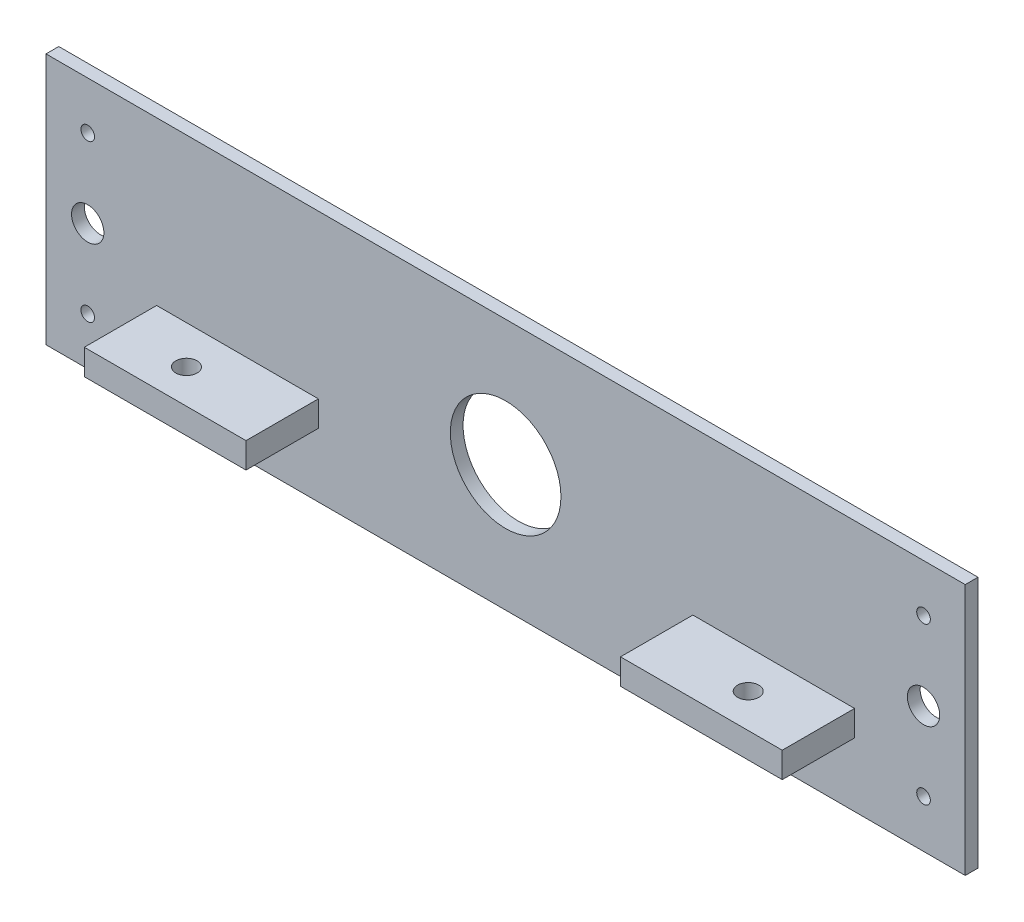
ISO-10303-21;
HEADER;
FILE_DESCRIPTION(('STEP AP214'),'2;1');
FILE_NAME('part.step','',(''),(''),'','','');
FILE_SCHEMA(('AUTOMOTIVE_DESIGN { 1 0 10303 214 1 1 1 1 }'));
ENDSEC;
DATA;
#1=APPLICATION_CONTEXT('core data for automotive mechanical design processes');
#2=APPLICATION_PROTOCOL_DEFINITION('international standard','automotive_design',2000,#1);
#3=PRODUCT_CONTEXT('',#1,'mechanical');
#4=PRODUCT('Part','Part','',(#3));
#5=PRODUCT_RELATED_PRODUCT_CATEGORY('part','',(#4));
#6=PRODUCT_DEFINITION_FORMATION('','',#4);
#7=PRODUCT_DEFINITION_CONTEXT('part definition',#1,'design');
#8=PRODUCT_DEFINITION('design','',#6,#7);
#9=PRODUCT_DEFINITION_SHAPE('','',#8);
#10=(LENGTH_UNIT() NAMED_UNIT(*) SI_UNIT(.MILLI.,.METRE.));
#11=(NAMED_UNIT(*) PLANE_ANGLE_UNIT() SI_UNIT($,.RADIAN.));
#12=(NAMED_UNIT(*) SI_UNIT($,.STERADIAN.) SOLID_ANGLE_UNIT());
#13=UNCERTAINTY_MEASURE_WITH_UNIT(LENGTH_MEASURE(1.E-05),#10,'distance_accuracy_value','');
#14=(GEOMETRIC_REPRESENTATION_CONTEXT(3) GLOBAL_UNCERTAINTY_ASSIGNED_CONTEXT((#13)) GLOBAL_UNIT_ASSIGNED_CONTEXT((#10,
#11,#12)) REPRESENTATION_CONTEXT('',''));
#15=CARTESIAN_POINT('',(0.,0.,0.));
#16=DIRECTION('',(0.,0.,1.));
#17=DIRECTION('',(1.,0.,0.));
#18=AXIS2_PLACEMENT_3D('',#15,#16,#17);
#19=CARTESIAN_POINT('',(54.,-14.8,-10.));
#20=DIRECTION('',(1.,0.,0.));
#21=DIRECTION('',(0.,0.,-1.));
#22=AXIS2_PLACEMENT_3D('',#19,#20,#21);
#23=PLANE('',#22);
#24=DIRECTION('',(0.,0.,1.));
#25=VECTOR('',#24,1.);
#26=CARTESIAN_POINT('',(54.,14.8,-10.));
#27=LINE('',#26,#25);
#28=CARTESIAN_POINT('',(54.,14.8,-10.));
#29=VERTEX_POINT('',#28);
#30=CARTESIAN_POINT('',(54.,14.8,-8.5));
#31=VERTEX_POINT('',#30);
#32=EDGE_CURVE('E239',#29,#31,#27,.T.);
#33=ORIENTED_EDGE('',*,*,#32,.T.);
#34=DIRECTION('',(0.,-1.,0.));
#35=VECTOR('',#34,1.);
#36=CARTESIAN_POINT('',(54.,-14.8,-8.5));
#37=LINE('',#36,#35);
#38=CARTESIAN_POINT('',(54.,-14.8,-8.5));
#39=VERTEX_POINT('',#38);
#40=EDGE_CURVE('E52',#31,#39,#37,.T.);
#41=ORIENTED_EDGE('',*,*,#40,.T.);
#42=DIRECTION('',(0.,0.,1.));
#43=VECTOR('',#42,1.);
#44=CARTESIAN_POINT('',(54.,-14.8,-10.));
#45=LINE('',#44,#43);
#46=CARTESIAN_POINT('',(54.,-14.8,-10.));
#47=VERTEX_POINT('',#46);
#48=EDGE_CURVE('E12',#47,#39,#45,.T.);
#49=ORIENTED_EDGE('',*,*,#48,.F.);
#50=DIRECTION('',(0.,1.,0.));
#51=VECTOR('',#50,1.);
#52=CARTESIAN_POINT('',(54.,-14.8,-10.));
#53=LINE('',#52,#51);
#54=EDGE_CURVE('E228',#47,#29,#53,.T.);
#55=ORIENTED_EDGE('',*,*,#54,.T.);
#56=EDGE_LOOP('',(#33,#41,#49,#55));
#57=FACE_BOUND('',#56,.T.);
#58=ADVANCED_FACE('F36',(#57),#23,.T.);
#59=CARTESIAN_POINT('',(-54.,-14.8,-10.));
#60=DIRECTION('',(0.,-1.,0.));
#61=DIRECTION('',(0.,0.,-1.));
#62=AXIS2_PLACEMENT_3D('',#59,#60,#61);
#63=PLANE('',#62);
#64=ORIENTED_EDGE('',*,*,#48,.T.);
#65=DIRECTION('',(-1.,0.,0.));
#66=VECTOR('',#65,1.);
#67=CARTESIAN_POINT('',(-54.,-14.8,-8.5));
#68=LINE('',#67,#66);
#69=CARTESIAN_POINT('',(-54.,-14.8,-8.5));
#70=VERTEX_POINT('',#69);
#71=EDGE_CURVE('E215',#39,#70,#68,.T.);
#72=ORIENTED_EDGE('',*,*,#71,.T.);
#73=DIRECTION('',(0.,0.,1.));
#74=VECTOR('',#73,1.);
#75=CARTESIAN_POINT('',(-54.,-14.8,-10.));
#76=LINE('',#75,#74);
#77=CARTESIAN_POINT('',(-54.,-14.8,-10.));
#78=VERTEX_POINT('',#77);
#79=EDGE_CURVE('E44',#78,#70,#76,.T.);
#80=ORIENTED_EDGE('',*,*,#79,.F.);
#81=DIRECTION('',(1.,0.,0.));
#82=VECTOR('',#81,1.);
#83=CARTESIAN_POINT('',(-54.,-14.8,-10.));
#84=LINE('',#83,#82);
#85=EDGE_CURVE('E237',#78,#47,#84,.T.);
#86=ORIENTED_EDGE('',*,*,#85,.T.);
#87=EDGE_LOOP('',(#64,#72,#80,#86));
#88=FACE_BOUND('',#87,.T.);
#89=ADVANCED_FACE('F259',(#88),#63,.T.);
#90=CARTESIAN_POINT('',(-54.,-14.8,-10.));
#91=DIRECTION('',(-1.,0.,0.));
#92=DIRECTION('',(0.,0.,1.));
#93=AXIS2_PLACEMENT_3D('',#90,#91,#92);
#94=PLANE('',#93);
#95=ORIENTED_EDGE('',*,*,#79,.T.);
#96=DIRECTION('',(0.,1.,0.));
#97=VECTOR('',#96,1.);
#98=CARTESIAN_POINT('',(-54.,-14.8,-8.5));
#99=LINE('',#98,#97);
#100=CARTESIAN_POINT('',(-54.,14.8,-8.5));
#101=VERTEX_POINT('',#100);
#102=EDGE_CURVE('E212',#70,#101,#99,.T.);
#103=ORIENTED_EDGE('',*,*,#102,.T.);
#104=DIRECTION('',(0.,0.,1.));
#105=VECTOR('',#104,1.);
#106=CARTESIAN_POINT('',(-54.,14.8,-10.));
#107=LINE('',#106,#105);
#108=CARTESIAN_POINT('',(-54.,14.8,-10.));
#109=VERTEX_POINT('',#108);
#110=EDGE_CURVE('E243',#109,#101,#107,.T.);
#111=ORIENTED_EDGE('',*,*,#110,.F.);
#112=DIRECTION('',(0.,-1.,0.));
#113=VECTOR('',#112,1.);
#114=CARTESIAN_POINT('',(-54.,-14.8,-10.));
#115=LINE('',#114,#113);
#116=EDGE_CURVE('E234',#109,#78,#115,.T.);
#117=ORIENTED_EDGE('',*,*,#116,.T.);
#118=EDGE_LOOP('',(#95,#103,#111,#117));
#119=FACE_BOUND('',#118,.T.);
#120=ADVANCED_FACE('F256',(#119),#94,.T.);
#121=CARTESIAN_POINT('',(-54.,14.8,-10.));
#122=DIRECTION('',(0.,1.,0.));
#123=DIRECTION('',(0.,0.,1.));
#124=AXIS2_PLACEMENT_3D('',#121,#122,#123);
#125=PLANE('',#124);
#126=ORIENTED_EDGE('',*,*,#110,.T.);
#127=DIRECTION('',(1.,0.,0.));
#128=VECTOR('',#127,1.);
#129=CARTESIAN_POINT('',(-54.,14.8,-8.5));
#130=LINE('',#129,#128);
#131=EDGE_CURVE('E210',#101,#31,#130,.T.);
#132=ORIENTED_EDGE('',*,*,#131,.T.);
#133=ORIENTED_EDGE('',*,*,#32,.F.);
#134=DIRECTION('',(-1.,0.,0.));
#135=VECTOR('',#134,1.);
#136=CARTESIAN_POINT('',(-54.,14.8,-10.));
#137=LINE('',#136,#135);
#138=EDGE_CURVE('E231',#29,#109,#137,.T.);
#139=ORIENTED_EDGE('',*,*,#138,.T.);
#140=EDGE_LOOP('',(#126,#132,#133,#139));
#141=FACE_BOUND('',#140,.T.);
#142=ADVANCED_FACE('F250',(#141),#125,.T.);
#143=CARTESIAN_POINT('',(-49.1,0.,-10.));
#144=DIRECTION('',(0.,0.,1.));
#145=DIRECTION('',(1.,0.,0.));
#146=AXIS2_PLACEMENT_3D('',#143,#144,#145);
#147=CYLINDRICAL_SURFACE('',#146,1.9);
#148=CARTESIAN_POINT('',(-49.1,0.,-10.));
#149=DIRECTION('',(0.,0.,1.));
#150=DIRECTION('',(1.,0.,0.));
#151=AXIS2_PLACEMENT_3D('',#148,#149,#150);
#152=CIRCLE('',#151,1.9);
#153=CARTESIAN_POINT('',(-47.2,0.,-10.));
#154=VERTEX_POINT('',#153);
#155=EDGE_CURVE('E225',#154,#154,#152,.T.);
#156=ORIENTED_EDGE('',*,*,#155,.F.);
#157=EDGE_LOOP('',(#156));
#158=FACE_BOUND('',#157,.T.);
#159=CARTESIAN_POINT('',(-49.1,0.,-8.5));
#160=DIRECTION('',(0.,0.,1.));
#161=DIRECTION('',(1.,0.,0.));
#162=AXIS2_PLACEMENT_3D('',#159,#160,#161);
#163=CIRCLE('',#162,1.9);
#164=CARTESIAN_POINT('',(-47.2,0.,-8.5));
#165=VERTEX_POINT('',#164);
#166=EDGE_CURVE('E207',#165,#165,#163,.F.);
#167=ORIENTED_EDGE('',*,*,#166,.F.);
#168=EDGE_LOOP('',(#167));
#169=FACE_BOUND('',#168,.T.);
#170=ADVANCED_FACE('F271',(#158,#169),#147,.F.);
#171=CARTESIAN_POINT('',(49.1,0.,-10.));
#172=DIRECTION('',(0.,0.,1.));
#173=DIRECTION('',(1.,0.,0.));
#174=AXIS2_PLACEMENT_3D('',#171,#172,#173);
#175=CYLINDRICAL_SURFACE('',#174,1.9);
#176=CARTESIAN_POINT('',(49.1,0.,-10.));
#177=DIRECTION('',(0.,0.,1.));
#178=DIRECTION('',(1.,0.,0.));
#179=AXIS2_PLACEMENT_3D('',#176,#177,#178);
#180=CIRCLE('',#179,1.9);
#181=CARTESIAN_POINT('',(51.,0.,-10.));
#182=VERTEX_POINT('',#181);
#183=EDGE_CURVE('E222',#182,#182,#180,.T.);
#184=ORIENTED_EDGE('',*,*,#183,.F.);
#185=EDGE_LOOP('',(#184));
#186=FACE_BOUND('',#185,.T.);
#187=CARTESIAN_POINT('',(49.1,0.,-8.5));
#188=DIRECTION('',(0.,0.,1.));
#189=DIRECTION('',(1.,0.,0.));
#190=AXIS2_PLACEMENT_3D('',#187,#188,#189);
#191=CIRCLE('',#190,1.9);
#192=CARTESIAN_POINT('',(51.,0.,-8.5));
#193=VERTEX_POINT('',#192);
#194=EDGE_CURVE('E204',#193,#193,#191,.F.);
#195=ORIENTED_EDGE('',*,*,#194,.F.);
#196=EDGE_LOOP('',(#195));
#197=FACE_BOUND('',#196,.T.);
#198=ADVANCED_FACE('F275',(#186,#197),#175,.F.);
#199=CARTESIAN_POINT('',(0.,0.,-10.));
#200=DIRECTION('',(0.,0.,1.));
#201=DIRECTION('',(1.,0.,0.));
#202=AXIS2_PLACEMENT_3D('',#199,#200,#201);
#203=CYLINDRICAL_SURFACE('',#202,6.5);
#204=CARTESIAN_POINT('',(0.,0.,-10.));
#205=DIRECTION('',(0.,0.,1.));
#206=DIRECTION('',(1.,0.,0.));
#207=AXIS2_PLACEMENT_3D('',#204,#205,#206);
#208=CIRCLE('',#207,6.5);
#209=CARTESIAN_POINT('',(6.5,0.,-10.));
#210=VERTEX_POINT('',#209);
#211=EDGE_CURVE('E219',#210,#210,#208,.T.);
#212=ORIENTED_EDGE('',*,*,#211,.F.);
#213=EDGE_LOOP('',(#212));
#214=FACE_BOUND('',#213,.T.);
#215=CARTESIAN_POINT('',(0.,0.,-8.5));
#216=DIRECTION('',(0.,0.,1.));
#217=DIRECTION('',(1.,0.,0.));
#218=AXIS2_PLACEMENT_3D('',#215,#216,#217);
#219=CIRCLE('',#218,6.5);
#220=CARTESIAN_POINT('',(6.5,0.,-8.5));
#221=VERTEX_POINT('',#220);
#222=EDGE_CURVE('E39',#221,#221,#219,.F.);
#223=ORIENTED_EDGE('',*,*,#222,.F.);
#224=EDGE_LOOP('',(#223));
#225=FACE_BOUND('',#224,.T.);
#226=ADVANCED_FACE('F281',(#214,#225),#203,.F.);
#227=CARTESIAN_POINT('',(54.,14.8,-10.));
#228=DIRECTION('',(0.,0.,-1.));
#229=DIRECTION('',(-1.,0.,0.));
#230=AXIS2_PLACEMENT_3D('',#227,#228,#229);
#231=PLANE('',#230);
#232=CARTESIAN_POINT('',(49.1,-9.2,-10.));
#233=DIRECTION('',(0.,0.,1.));
#234=DIRECTION('',(1.,0.,0.));
#235=AXIS2_PLACEMENT_3D('',#232,#233,#234);
#236=CIRCLE('',#235,0.800000000000002);
#237=CARTESIAN_POINT('',(49.9,-9.2,-10.));
#238=VERTEX_POINT('',#237);
#239=EDGE_CURVE('E300',#238,#238,#236,.T.);
#240=ORIENTED_EDGE('',*,*,#239,.T.);
#241=EDGE_LOOP('',(#240));
#242=FACE_BOUND('',#241,.T.);
#243=CARTESIAN_POINT('',(49.1,9.2,-10.));
#244=DIRECTION('',(0.,0.,1.));
#245=DIRECTION('',(1.,0.,0.));
#246=AXIS2_PLACEMENT_3D('',#243,#244,#245);
#247=CIRCLE('',#246,0.800000000000002);
#248=CARTESIAN_POINT('',(49.9,9.2,-10.));
#249=VERTEX_POINT('',#248);
#250=EDGE_CURVE('E304',#249,#249,#247,.T.);
#251=ORIENTED_EDGE('',*,*,#250,.T.);
#252=EDGE_LOOP('',(#251));
#253=FACE_BOUND('',#252,.T.);
#254=CARTESIAN_POINT('',(-49.1,-9.2,-10.));
#255=DIRECTION('',(0.,0.,1.));
#256=DIRECTION('',(1.,0.,0.));
#257=AXIS2_PLACEMENT_3D('',#254,#255,#256);
#258=CIRCLE('',#257,0.800000000000002);
#259=CARTESIAN_POINT('',(-48.3,-9.2,-10.));
#260=VERTEX_POINT('',#259);
#261=EDGE_CURVE('E308',#260,#260,#258,.T.);
#262=ORIENTED_EDGE('',*,*,#261,.T.);
#263=EDGE_LOOP('',(#262));
#264=FACE_BOUND('',#263,.T.);
#265=CARTESIAN_POINT('',(-49.1,9.2,-10.));
#266=DIRECTION('',(0.,0.,1.));
#267=DIRECTION('',(1.,0.,0.));
#268=AXIS2_PLACEMENT_3D('',#265,#266,#267);
#269=CIRCLE('',#268,0.800000000000002);
#270=CARTESIAN_POINT('',(-48.3,9.2,-10.));
#271=VERTEX_POINT('',#270);
#272=EDGE_CURVE('E312',#271,#271,#269,.T.);
#273=ORIENTED_EDGE('',*,*,#272,.T.);
#274=EDGE_LOOP('',(#273));
#275=FACE_BOUND('',#274,.T.);
#276=ORIENTED_EDGE('',*,*,#211,.T.);
#277=EDGE_LOOP('',(#276));
#278=FACE_BOUND('',#277,.T.);
#279=ORIENTED_EDGE('',*,*,#183,.T.);
#280=EDGE_LOOP('',(#279));
#281=FACE_BOUND('',#280,.T.);
#282=ORIENTED_EDGE('',*,*,#155,.T.);
#283=EDGE_LOOP('',(#282));
#284=FACE_BOUND('',#283,.T.);
#285=ORIENTED_EDGE('',*,*,#54,.F.);
#286=ORIENTED_EDGE('',*,*,#85,.F.);
#287=ORIENTED_EDGE('',*,*,#116,.F.);
#288=ORIENTED_EDGE('',*,*,#138,.F.);
#289=EDGE_LOOP('',(#285,#286,#287,#288));
#290=FACE_BOUND('',#289,.T.);
#291=ADVANCED_FACE('F253',(#242,#253,#264,#275,#278,#281,#284,#290),#231,.T.);
#292=CARTESIAN_POINT('',(0.,0.,-8.5));
#293=DIRECTION('',(0.,0.,1.));
#294=DIRECTION('',(1.,0.,0.));
#295=AXIS2_PLACEMENT_3D('',#292,#293,#294);
#296=PLANE('',#295);
#297=CARTESIAN_POINT('',(49.1,-9.2,-8.5));
#298=DIRECTION('',(0.,0.,1.));
#299=DIRECTION('',(1.,0.,0.));
#300=AXIS2_PLACEMENT_3D('',#297,#298,#299);
#301=CIRCLE('',#300,0.799999999999988);
#302=CARTESIAN_POINT('',(49.9,-9.2,-8.5));
#303=VERTEX_POINT('',#302);
#304=EDGE_CURVE('E545',#303,#303,#301,.T.);
#305=ORIENTED_EDGE('',*,*,#304,.F.);
#306=EDGE_LOOP('',(#305));
#307=FACE_BOUND('',#306,.T.);
#308=CARTESIAN_POINT('',(49.1,9.2,-8.5));
#309=DIRECTION('',(0.,0.,1.));
#310=DIRECTION('',(1.,0.,0.));
#311=AXIS2_PLACEMENT_3D('',#308,#309,#310);
#312=CIRCLE('',#311,0.799999999999988);
#313=CARTESIAN_POINT('',(49.9,9.2,-8.5));
#314=VERTEX_POINT('',#313);
#315=EDGE_CURVE('E547',#314,#314,#312,.T.);
#316=ORIENTED_EDGE('',*,*,#315,.F.);
#317=EDGE_LOOP('',(#316));
#318=FACE_BOUND('',#317,.T.);
#319=CARTESIAN_POINT('',(-49.1,-9.2,-8.5));
#320=DIRECTION('',(0.,0.,1.));
#321=DIRECTION('',(1.,0.,0.));
#322=AXIS2_PLACEMENT_3D('',#319,#320,#321);
#323=CIRCLE('',#322,0.799999999999988);
#324=CARTESIAN_POINT('',(-48.3,-9.2,-8.5));
#325=VERTEX_POINT('',#324);
#326=EDGE_CURVE('E553',#325,#325,#323,.T.);
#327=ORIENTED_EDGE('',*,*,#326,.F.);
#328=EDGE_LOOP('',(#327));
#329=FACE_BOUND('',#328,.T.);
#330=CARTESIAN_POINT('',(-49.1,9.2,-8.5));
#331=DIRECTION('',(0.,0.,1.));
#332=DIRECTION('',(1.,0.,0.));
#333=AXIS2_PLACEMENT_3D('',#330,#331,#332);
#334=CIRCLE('',#333,0.799999999999988);
#335=CARTESIAN_POINT('',(-48.3,9.2,-8.5));
#336=VERTEX_POINT('',#335);
#337=EDGE_CURVE('E557',#336,#336,#334,.T.);
#338=ORIENTED_EDGE('',*,*,#337,.F.);
#339=EDGE_LOOP('',(#338));
#340=FACE_BOUND('',#339,.T.);
#341=ORIENTED_EDGE('',*,*,#131,.F.);
#342=ORIENTED_EDGE('',*,*,#102,.F.);
#343=ORIENTED_EDGE('',*,*,#71,.F.);
#344=ORIENTED_EDGE('',*,*,#40,.F.);
#345=EDGE_LOOP('',(#341,#342,#343,#344));
#346=FACE_BOUND('',#345,.T.);
#347=ORIENTED_EDGE('',*,*,#194,.T.);
#348=EDGE_LOOP('',(#347));
#349=FACE_BOUND('',#348,.T.);
#350=DIRECTION('',(1.,0.,0.));
#351=VECTOR('',#350,1.);
#352=CARTESIAN_POINT('',(41.,-7.3,-8.5));
#353=LINE('',#352,#351);
#354=CARTESIAN_POINT('',(22.,-7.3,-8.5));
#355=VERTEX_POINT('',#354);
#356=CARTESIAN_POINT('',(41.,-7.3,-8.5));
#357=VERTEX_POINT('',#356);
#358=EDGE_CURVE('E185',#355,#357,#353,.T.);
#359=ORIENTED_EDGE('',*,*,#358,.F.);
#360=DIRECTION('',(0.,-1.,0.));
#361=VECTOR('',#360,1.);
#362=CARTESIAN_POINT('',(22.,-7.3,-8.5));
#363=LINE('',#362,#361);
#364=CARTESIAN_POINT('',(22.,-4.3,-8.5));
#365=VERTEX_POINT('',#364);
#366=EDGE_CURVE('E182',#365,#355,#363,.T.);
#367=ORIENTED_EDGE('',*,*,#366,.F.);
#368=DIRECTION('',(-1.,0.,0.));
#369=VECTOR('',#368,1.);
#370=CARTESIAN_POINT('',(41.,-4.3,-8.5));
#371=LINE('',#370,#369);
#372=CARTESIAN_POINT('',(41.,-4.3,-8.5));
#373=VERTEX_POINT('',#372);
#374=EDGE_CURVE('E178',#373,#365,#371,.T.);
#375=ORIENTED_EDGE('',*,*,#374,.F.);
#376=DIRECTION('',(0.,1.,0.));
#377=VECTOR('',#376,1.);
#378=CARTESIAN_POINT('',(41.,-7.3,-8.5));
#379=LINE('',#378,#377);
#380=EDGE_CURVE('E175',#357,#373,#379,.T.);
#381=ORIENTED_EDGE('',*,*,#380,.F.);
#382=EDGE_LOOP('',(#359,#367,#375,#381));
#383=FACE_BOUND('',#382,.T.);
#384=DIRECTION('',(-1.,0.,0.));
#385=VECTOR('',#384,1.);
#386=CARTESIAN_POINT('',(-41.,-4.3,-8.5));
#387=LINE('',#386,#385);
#388=CARTESIAN_POINT('',(-22.,-4.3,-8.5));
#389=VERTEX_POINT('',#388);
#390=CARTESIAN_POINT('',(-41.,-4.3,-8.5));
#391=VERTEX_POINT('',#390);
#392=EDGE_CURVE('E139',#389,#391,#387,.T.);
#393=ORIENTED_EDGE('',*,*,#392,.F.);
#394=DIRECTION('',(0.,1.,0.));
#395=VECTOR('',#394,1.);
#396=CARTESIAN_POINT('',(-22.,-4.3,-8.5));
#397=LINE('',#396,#395);
#398=CARTESIAN_POINT('',(-22.,-7.3,-8.5));
#399=VERTEX_POINT('',#398);
#400=EDGE_CURVE('E149',#399,#389,#397,.T.);
#401=ORIENTED_EDGE('',*,*,#400,.F.);
#402=DIRECTION('',(1.,0.,0.));
#403=VECTOR('',#402,1.);
#404=CARTESIAN_POINT('',(-41.,-7.3,-8.5));
#405=LINE('',#404,#403);
#406=CARTESIAN_POINT('',(-41.,-7.3,-8.5));
#407=VERTEX_POINT('',#406);
#408=EDGE_CURVE('E131',#407,#399,#405,.T.);
#409=ORIENTED_EDGE('',*,*,#408,.F.);
#410=DIRECTION('',(0.,-1.,0.));
#411=VECTOR('',#410,1.);
#412=CARTESIAN_POINT('',(-41.,-4.3,-8.5));
#413=LINE('',#412,#411);
#414=EDGE_CURVE('E146',#391,#407,#413,.T.);
#415=ORIENTED_EDGE('',*,*,#414,.F.);
#416=EDGE_LOOP('',(#393,#401,#409,#415));
#417=FACE_BOUND('',#416,.T.);
#418=ORIENTED_EDGE('',*,*,#222,.T.);
#419=EDGE_LOOP('',(#418));
#420=FACE_BOUND('',#419,.T.);
#421=ORIENTED_EDGE('',*,*,#166,.T.);
#422=EDGE_LOOP('',(#421));
#423=FACE_BOUND('',#422,.T.);
#424=ADVANCED_FACE('F144',(#307,#318,#329,#340,#346,#349,#383,#417,#420,#423),#296,.T.);
#425=CARTESIAN_POINT('',(41.,-7.3,-8.5));
#426=DIRECTION('',(1.,0.,0.));
#427=DIRECTION('',(0.,0.,-1.));
#428=AXIS2_PLACEMENT_3D('',#425,#426,#427);
#429=PLANE('',#428);
#430=DIRECTION('',(0.,1.,0.));
#431=VECTOR('',#430,1.);
#432=CARTESIAN_POINT('',(41.,-7.3,0.));
#433=LINE('',#432,#431);
#434=CARTESIAN_POINT('',(41.,-7.3,0.));
#435=VERTEX_POINT('',#434);
#436=CARTESIAN_POINT('',(41.,-4.3,0.));
#437=VERTEX_POINT('',#436);
#438=EDGE_CURVE('E171',#435,#437,#433,.T.);
#439=ORIENTED_EDGE('',*,*,#438,.F.);
#440=DIRECTION('',(0.,0.,1.));
#441=VECTOR('',#440,1.);
#442=CARTESIAN_POINT('',(41.,-7.3,-8.5));
#443=LINE('',#442,#441);
#444=EDGE_CURVE('E197',#357,#435,#443,.T.);
#445=ORIENTED_EDGE('',*,*,#444,.F.);
#446=ORIENTED_EDGE('',*,*,#380,.T.);
#447=DIRECTION('',(0.,0.,1.));
#448=VECTOR('',#447,1.);
#449=CARTESIAN_POINT('',(41.,-4.3,-8.5));
#450=LINE('',#449,#448);
#451=EDGE_CURVE('E188',#373,#437,#450,.T.);
#452=ORIENTED_EDGE('',*,*,#451,.T.);
#453=EDGE_LOOP('',(#439,#445,#446,#452));
#454=FACE_BOUND('',#453,.T.);
#455=ADVANCED_FACE('F293',(#454),#429,.T.);
#456=CARTESIAN_POINT('',(41.,-7.3,-8.5));
#457=DIRECTION('',(0.,-1.,0.));
#458=DIRECTION('',(1.,0.,0.));
#459=AXIS2_PLACEMENT_3D('',#456,#457,#458);
#460=PLANE('',#459);
#461=CARTESIAN_POINT('',(33.,-7.3,-4.));
#462=DIRECTION('',(0.,-1.,0.));
#463=DIRECTION('',(1.,0.,0.));
#464=AXIS2_PLACEMENT_3D('',#461,#462,#463);
#465=CIRCLE('',#464,1.24999999999999);
#466=CARTESIAN_POINT('',(34.25,-7.3,-4.));
#467=VERTEX_POINT('',#466);
#468=EDGE_CURVE('E564',#467,#467,#465,.T.);
#469=ORIENTED_EDGE('',*,*,#468,.F.);
#470=EDGE_LOOP('',(#469));
#471=FACE_BOUND('',#470,.T.);
#472=DIRECTION('',(1.,0.,0.));
#473=VECTOR('',#472,1.);
#474=CARTESIAN_POINT('',(41.,-7.3,0.));
#475=LINE('',#474,#473);
#476=CARTESIAN_POINT('',(22.,-7.3,0.));
#477=VERTEX_POINT('',#476);
#478=EDGE_CURVE('E179',#477,#435,#475,.T.);
#479=ORIENTED_EDGE('',*,*,#478,.F.);
#480=DIRECTION('',(0.,0.,1.));
#481=VECTOR('',#480,1.);
#482=CARTESIAN_POINT('',(22.,-7.3,-8.5));
#483=LINE('',#482,#481);
#484=EDGE_CURVE('E199',#355,#477,#483,.T.);
#485=ORIENTED_EDGE('',*,*,#484,.F.);
#486=ORIENTED_EDGE('',*,*,#358,.T.);
#487=ORIENTED_EDGE('',*,*,#444,.T.);
#488=EDGE_LOOP('',(#479,#485,#486,#487));
#489=FACE_BOUND('',#488,.T.);
#490=ADVANCED_FACE('F331',(#471,#489),#460,.T.);
#491=CARTESIAN_POINT('',(22.,-7.3,-8.5));
#492=DIRECTION('',(-1.,0.,0.));
#493=DIRECTION('',(0.,0.,1.));
#494=AXIS2_PLACEMENT_3D('',#491,#492,#493);
#495=PLANE('',#494);
#496=DIRECTION('',(0.,-1.,0.));
#497=VECTOR('',#496,1.);
#498=CARTESIAN_POINT('',(22.,-7.3,0.));
#499=LINE('',#498,#497);
#500=CARTESIAN_POINT('',(22.,-4.3,0.));
#501=VERTEX_POINT('',#500);
#502=EDGE_CURVE('E60',#501,#477,#499,.T.);
#503=ORIENTED_EDGE('',*,*,#502,.F.);
#504=DIRECTION('',(0.,0.,1.));
#505=VECTOR('',#504,1.);
#506=CARTESIAN_POINT('',(22.,-4.3,-8.5));
#507=LINE('',#506,#505);
#508=EDGE_CURVE('E201',#365,#501,#507,.T.);
#509=ORIENTED_EDGE('',*,*,#508,.F.);
#510=ORIENTED_EDGE('',*,*,#366,.T.);
#511=ORIENTED_EDGE('',*,*,#484,.T.);
#512=EDGE_LOOP('',(#503,#509,#510,#511));
#513=FACE_BOUND('',#512,.T.);
#514=ADVANCED_FACE('F324',(#513),#495,.T.);
#515=CARTESIAN_POINT('',(41.,-4.3,-8.5));
#516=DIRECTION('',(0.,1.,0.));
#517=DIRECTION('',(-1.,0.,0.));
#518=AXIS2_PLACEMENT_3D('',#515,#516,#517);
#519=PLANE('',#518);
#520=CARTESIAN_POINT('',(33.,-4.3,-4.));
#521=DIRECTION('',(0.,1.,0.));
#522=DIRECTION('',(0.,0.,1.));
#523=AXIS2_PLACEMENT_3D('',#520,#521,#522);
#524=CIRCLE('',#523,1.24999999999999);
#525=CARTESIAN_POINT('',(33.,-4.3,-2.75000000000001));
#526=VERTEX_POINT('',#525);
#527=EDGE_CURVE('E561',#526,#526,#524,.T.);
#528=ORIENTED_EDGE('',*,*,#527,.F.);
#529=EDGE_LOOP('',(#528));
#530=FACE_BOUND('',#529,.T.);
#531=DIRECTION('',(-1.,0.,0.));
#532=VECTOR('',#531,1.);
#533=CARTESIAN_POINT('',(41.,-4.3,0.));
#534=LINE('',#533,#532);
#535=EDGE_CURVE('E191',#437,#501,#534,.T.);
#536=ORIENTED_EDGE('',*,*,#535,.F.);
#537=ORIENTED_EDGE('',*,*,#451,.F.);
#538=ORIENTED_EDGE('',*,*,#374,.T.);
#539=ORIENTED_EDGE('',*,*,#508,.T.);
#540=EDGE_LOOP('',(#536,#537,#538,#539));
#541=FACE_BOUND('',#540,.T.);
#542=ADVANCED_FACE('F328',(#530,#541),#519,.T.);
#543=CARTESIAN_POINT('',(-41.,-4.3,-8.5));
#544=DIRECTION('',(-1.,0.,0.));
#545=DIRECTION('',(0.,0.,1.));
#546=AXIS2_PLACEMENT_3D('',#543,#544,#545);
#547=PLANE('',#546);
#548=DIRECTION('',(0.,-1.,0.));
#549=VECTOR('',#548,1.);
#550=CARTESIAN_POINT('',(-41.,-4.3,0.));
#551=LINE('',#550,#549);
#552=CARTESIAN_POINT('',(-41.,-4.3,0.));
#553=VERTEX_POINT('',#552);
#554=CARTESIAN_POINT('',(-41.,-7.3,0.));
#555=VERTEX_POINT('',#554);
#556=EDGE_CURVE('E165',#553,#555,#551,.T.);
#557=ORIENTED_EDGE('',*,*,#556,.F.);
#558=DIRECTION('',(0.,0.,1.));
#559=VECTOR('',#558,1.);
#560=CARTESIAN_POINT('',(-41.,-4.3,-8.5));
#561=LINE('',#560,#559);
#562=EDGE_CURVE('E153',#391,#553,#561,.T.);
#563=ORIENTED_EDGE('',*,*,#562,.F.);
#564=ORIENTED_EDGE('',*,*,#414,.T.);
#565=DIRECTION('',(0.,0.,1.));
#566=VECTOR('',#565,1.);
#567=CARTESIAN_POINT('',(-41.,-7.3,-8.5));
#568=LINE('',#567,#566);
#569=EDGE_CURVE('E127',#407,#555,#568,.T.);
#570=ORIENTED_EDGE('',*,*,#569,.T.);
#571=EDGE_LOOP('',(#557,#563,#564,#570));
#572=FACE_BOUND('',#571,.T.);
#573=ADVANCED_FACE('F152',(#572),#547,.T.);
#574=CARTESIAN_POINT('',(-41.,-4.3,-8.5));
#575=DIRECTION('',(0.,1.,0.));
#576=DIRECTION('',(0.,0.,1.));
#577=AXIS2_PLACEMENT_3D('',#574,#575,#576);
#578=PLANE('',#577);
#579=CARTESIAN_POINT('',(-33.,-4.3,-4.));
#580=DIRECTION('',(0.,1.,0.));
#581=DIRECTION('',(0.,0.,1.));
#582=AXIS2_PLACEMENT_3D('',#579,#580,#581);
#583=CIRCLE('',#582,1.24999999999999);
#584=CARTESIAN_POINT('',(-33.,-4.3,-2.75000000000001));
#585=VERTEX_POINT('',#584);
#586=EDGE_CURVE('E566',#585,#585,#583,.T.);
#587=ORIENTED_EDGE('',*,*,#586,.F.);
#588=EDGE_LOOP('',(#587));
#589=FACE_BOUND('',#588,.T.);
#590=DIRECTION('',(-1.,0.,0.));
#591=VECTOR('',#590,1.);
#592=CARTESIAN_POINT('',(-41.,-4.3,0.));
#593=LINE('',#592,#591);
#594=CARTESIAN_POINT('',(-22.,-4.3,0.));
#595=VERTEX_POINT('',#594);
#596=EDGE_CURVE('E154',#595,#553,#593,.T.);
#597=ORIENTED_EDGE('',*,*,#596,.F.);
#598=DIRECTION('',(0.,0.,1.));
#599=VECTOR('',#598,1.);
#600=CARTESIAN_POINT('',(-22.,-4.3,-8.5));
#601=LINE('',#600,#599);
#602=EDGE_CURVE('E172',#389,#595,#601,.T.);
#603=ORIENTED_EDGE('',*,*,#602,.F.);
#604=ORIENTED_EDGE('',*,*,#392,.T.);
#605=ORIENTED_EDGE('',*,*,#562,.T.);
#606=EDGE_LOOP('',(#597,#603,#604,#605));
#607=FACE_BOUND('',#606,.T.);
#608=ADVANCED_FACE('F352',(#589,#607),#578,.T.);
#609=CARTESIAN_POINT('',(-22.,-4.3,-8.5));
#610=DIRECTION('',(1.,0.,0.));
#611=DIRECTION('',(0.,0.,-1.));
#612=AXIS2_PLACEMENT_3D('',#609,#610,#611);
#613=PLANE('',#612);
#614=DIRECTION('',(0.,1.,0.));
#615=VECTOR('',#614,1.);
#616=CARTESIAN_POINT('',(-22.,-4.3,0.));
#617=LINE('',#616,#615);
#618=CARTESIAN_POINT('',(-22.,-7.3,0.));
#619=VERTEX_POINT('',#618);
#620=EDGE_CURVE('E157',#619,#595,#617,.T.);
#621=ORIENTED_EDGE('',*,*,#620,.F.);
#622=DIRECTION('',(0.,0.,1.));
#623=VECTOR('',#622,1.);
#624=CARTESIAN_POINT('',(-22.,-7.3,-8.5));
#625=LINE('',#624,#623);
#626=EDGE_CURVE('E138',#399,#619,#625,.T.);
#627=ORIENTED_EDGE('',*,*,#626,.F.);
#628=ORIENTED_EDGE('',*,*,#400,.T.);
#629=ORIENTED_EDGE('',*,*,#602,.T.);
#630=EDGE_LOOP('',(#621,#627,#628,#629));
#631=FACE_BOUND('',#630,.T.);
#632=ADVANCED_FACE('F347',(#631),#613,.T.);
#633=CARTESIAN_POINT('',(-41.,-7.3,-8.5));
#634=DIRECTION('',(0.,-1.,0.));
#635=DIRECTION('',(0.,0.,-1.));
#636=AXIS2_PLACEMENT_3D('',#633,#634,#635);
#637=PLANE('',#636);
#638=CARTESIAN_POINT('',(-33.,-7.3,-4.));
#639=DIRECTION('',(0.,-1.,0.));
#640=DIRECTION('',(0.,0.,-1.));
#641=AXIS2_PLACEMENT_3D('',#638,#639,#640);
#642=CIRCLE('',#641,1.24999999999999);
#643=CARTESIAN_POINT('',(-33.,-7.3,-5.24999999999999));
#644=VERTEX_POINT('',#643);
#645=EDGE_CURVE('E160',#644,#644,#642,.T.);
#646=ORIENTED_EDGE('',*,*,#645,.F.);
#647=EDGE_LOOP('',(#646));
#648=FACE_BOUND('',#647,.T.);
#649=DIRECTION('',(1.,0.,0.));
#650=VECTOR('',#649,1.);
#651=CARTESIAN_POINT('',(-41.,-7.3,0.));
#652=LINE('',#651,#650);
#653=EDGE_CURVE('E133',#555,#619,#652,.T.);
#654=ORIENTED_EDGE('',*,*,#653,.F.);
#655=ORIENTED_EDGE('',*,*,#569,.F.);
#656=ORIENTED_EDGE('',*,*,#408,.T.);
#657=ORIENTED_EDGE('',*,*,#626,.T.);
#658=EDGE_LOOP('',(#654,#655,#656,#657));
#659=FACE_BOUND('',#658,.T.);
#660=ADVANCED_FACE('F129',(#648,#659),#637,.T.);
#661=CARTESIAN_POINT('',(54.,14.8,0.));
#662=DIRECTION('',(0.,0.,-1.));
#663=DIRECTION('',(-1.,0.,0.));
#664=AXIS2_PLACEMENT_3D('',#661,#662,#663);
#665=PLANE('',#664);
#666=ORIENTED_EDGE('',*,*,#556,.T.);
#667=ORIENTED_EDGE('',*,*,#653,.T.);
#668=ORIENTED_EDGE('',*,*,#620,.T.);
#669=ORIENTED_EDGE('',*,*,#596,.T.);
#670=EDGE_LOOP('',(#666,#667,#668,#669));
#671=FACE_BOUND('',#670,.T.);
#672=ADVANCED_FACE('F335',(#671),#665,.F.);
#673=ORIENTED_EDGE('',*,*,#438,.T.);
#674=ORIENTED_EDGE('',*,*,#535,.T.);
#675=ORIENTED_EDGE('',*,*,#502,.T.);
#676=ORIENTED_EDGE('',*,*,#478,.T.);
#677=EDGE_LOOP('',(#673,#674,#675,#676));
#678=FACE_BOUND('',#677,.T.);
#679=ADVANCED_FACE('F268',(#678),#665,.F.);
#680=CARTESIAN_POINT('',(-33.,-4.3,-4.));
#681=DIRECTION('',(0.,1.,0.));
#682=DIRECTION('',(0.,0.,1.));
#683=AXIS2_PLACEMENT_3D('',#680,#681,#682);
#684=CYLINDRICAL_SURFACE('',#683,1.24999999999999);
#685=ORIENTED_EDGE('',*,*,#645,.T.);
#686=EDGE_LOOP('',(#685));
#687=FACE_BOUND('',#686,.T.);
#688=ORIENTED_EDGE('',*,*,#586,.T.);
#689=EDGE_LOOP('',(#688));
#690=FACE_BOUND('',#689,.T.);
#691=ADVANCED_FACE('F334',(#687,#690),#684,.F.);
#692=CARTESIAN_POINT('',(33.,-4.3,-4.));
#693=DIRECTION('',(0.,1.,0.));
#694=DIRECTION('',(0.,0.,1.));
#695=AXIS2_PLACEMENT_3D('',#692,#693,#694);
#696=CYLINDRICAL_SURFACE('',#695,1.24999999999999);
#697=ORIENTED_EDGE('',*,*,#468,.T.);
#698=EDGE_LOOP('',(#697));
#699=FACE_BOUND('',#698,.T.);
#700=ORIENTED_EDGE('',*,*,#527,.T.);
#701=EDGE_LOOP('',(#700));
#702=FACE_BOUND('',#701,.T.);
#703=ADVANCED_FACE('F340',(#699,#702),#696,.F.);
#704=CARTESIAN_POINT('',(-49.1,9.2,-8.5));
#705=DIRECTION('',(0.,0.,1.));
#706=DIRECTION('',(1.,0.,0.));
#707=AXIS2_PLACEMENT_3D('',#704,#705,#706);
#708=CYLINDRICAL_SURFACE('',#707,0.799999999999995);
#709=ORIENTED_EDGE('',*,*,#272,.F.);
#710=EDGE_LOOP('',(#709));
#711=FACE_BOUND('',#710,.T.);
#712=ORIENTED_EDGE('',*,*,#337,.T.);
#713=EDGE_LOOP('',(#712));
#714=FACE_BOUND('',#713,.T.);
#715=ADVANCED_FACE('F422',(#711,#714),#708,.F.);
#716=CARTESIAN_POINT('',(-49.1,-9.2,-8.5));
#717=DIRECTION('',(0.,0.,1.));
#718=DIRECTION('',(1.,0.,0.));
#719=AXIS2_PLACEMENT_3D('',#716,#717,#718);
#720=CYLINDRICAL_SURFACE('',#719,0.799999999999995);
#721=ORIENTED_EDGE('',*,*,#261,.F.);
#722=EDGE_LOOP('',(#721));
#723=FACE_BOUND('',#722,.T.);
#724=ORIENTED_EDGE('',*,*,#326,.T.);
#725=EDGE_LOOP('',(#724));
#726=FACE_BOUND('',#725,.T.);
#727=ADVANCED_FACE('F429',(#723,#726),#720,.F.);
#728=CARTESIAN_POINT('',(49.1,9.2,-8.5));
#729=DIRECTION('',(0.,0.,1.));
#730=DIRECTION('',(1.,0.,0.));
#731=AXIS2_PLACEMENT_3D('',#728,#729,#730);
#732=CYLINDRICAL_SURFACE('',#731,0.799999999999995);
#733=ORIENTED_EDGE('',*,*,#250,.F.);
#734=EDGE_LOOP('',(#733));
#735=FACE_BOUND('',#734,.T.);
#736=ORIENTED_EDGE('',*,*,#315,.T.);
#737=EDGE_LOOP('',(#736));
#738=FACE_BOUND('',#737,.T.);
#739=ADVANCED_FACE('F437',(#735,#738),#732,.F.);
#740=CARTESIAN_POINT('',(49.1,-9.2,-8.5));
#741=DIRECTION('',(0.,0.,1.));
#742=DIRECTION('',(1.,0.,0.));
#743=AXIS2_PLACEMENT_3D('',#740,#741,#742);
#744=CYLINDRICAL_SURFACE('',#743,0.799999999999995);
#745=ORIENTED_EDGE('',*,*,#239,.F.);
#746=EDGE_LOOP('',(#745));
#747=FACE_BOUND('',#746,.T.);
#748=ORIENTED_EDGE('',*,*,#304,.T.);
#749=EDGE_LOOP('',(#748));
#750=FACE_BOUND('',#749,.T.);
#751=ADVANCED_FACE('F445',(#747,#750),#744,.F.);
#752=CLOSED_SHELL('',(#58,#89,#120,#142,#170,#198,#226,#291,#424,#455,#490,#514,#542,#573,#608,
#632,#660,#672,#679,#691,#703,#715,#727,#739,#751));
#753=MANIFOLD_SOLID_BREP('B2',#752);
#754=ADVANCED_BREP_SHAPE_REPRESENTATION('',(#18,#753),#14);
#755=SHAPE_DEFINITION_REPRESENTATION(#9,#754);
ENDSEC;
END-ISO-10303-21;
